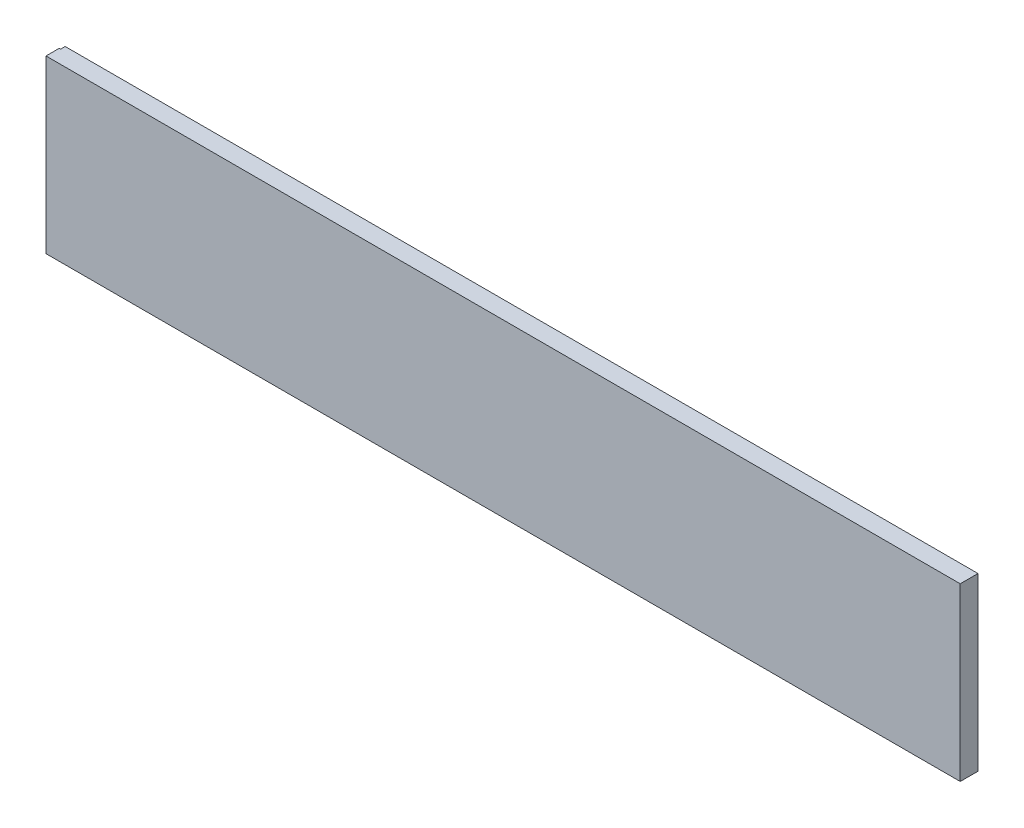
ISO-10303-21;
HEADER;
FILE_DESCRIPTION(('STEP AP214'),'2;1');
FILE_NAME('part.step','',(''),(''),'','','');
FILE_SCHEMA(('AUTOMOTIVE_DESIGN { 1 0 10303 214 1 1 1 1 }'));
ENDSEC;
DATA;
#1=APPLICATION_CONTEXT('core data for automotive mechanical design processes');
#2=APPLICATION_PROTOCOL_DEFINITION('international standard','automotive_design',2000,#1);
#3=PRODUCT_CONTEXT('',#1,'mechanical');
#4=PRODUCT('Part','Part','',(#3));
#5=PRODUCT_RELATED_PRODUCT_CATEGORY('part','',(#4));
#6=PRODUCT_DEFINITION_FORMATION('','',#4);
#7=PRODUCT_DEFINITION_CONTEXT('part definition',#1,'design');
#8=PRODUCT_DEFINITION('design','',#6,#7);
#9=PRODUCT_DEFINITION_SHAPE('','',#8);
#10=(LENGTH_UNIT() NAMED_UNIT(*) SI_UNIT(.MILLI.,.METRE.));
#11=(NAMED_UNIT(*) PLANE_ANGLE_UNIT() SI_UNIT($,.RADIAN.));
#12=(NAMED_UNIT(*) SI_UNIT($,.STERADIAN.) SOLID_ANGLE_UNIT());
#13=UNCERTAINTY_MEASURE_WITH_UNIT(LENGTH_MEASURE(1.E-05),#10,'distance_accuracy_value','');
#14=(GEOMETRIC_REPRESENTATION_CONTEXT(3) GLOBAL_UNCERTAINTY_ASSIGNED_CONTEXT((#13)) GLOBAL_UNIT_ASSIGNED_CONTEXT((#10,
#11,#12)) REPRESENTATION_CONTEXT('',''));
#15=CARTESIAN_POINT('',(0.,0.,0.));
#16=DIRECTION('',(0.,0.,1.));
#17=DIRECTION('',(1.,0.,0.));
#18=AXIS2_PLACEMENT_3D('',#15,#16,#17);
#19=CARTESIAN_POINT('',(0.,95.04,20.));
#20=DIRECTION('',(0.,0.,-1.));
#21=DIRECTION('',(-1.,0.,0.));
#22=AXIS2_PLACEMENT_3D('',#19,#20,#21);
#23=CYLINDRICAL_SURFACE('',#22,20.52);
#24=CARTESIAN_POINT('',(0.,95.04,20.));
#25=DIRECTION('',(0.,0.,1.));
#26=DIRECTION('',(1.,0.,0.));
#27=AXIS2_PLACEMENT_3D('',#24,#25,#26);
#28=CIRCLE('',#27,20.52);
#29=CARTESIAN_POINT('',(20.52,95.04,20.));
#30=VERTEX_POINT('',#29);
#31=EDGE_CURVE('E220',#30,#30,#28,.T.);
#32=ORIENTED_EDGE('',*,*,#31,.T.);
#33=EDGE_LOOP('',(#32));
#34=FACE_BOUND('',#33,.T.);
#35=CARTESIAN_POINT('',(0.,95.04,0.));
#36=DIRECTION('',(0.,0.,1.));
#37=DIRECTION('',(1.,0.,0.));
#38=AXIS2_PLACEMENT_3D('',#35,#36,#37);
#39=CIRCLE('',#38,20.52);
#40=CARTESIAN_POINT('',(20.52,95.04,0.));
#41=VERTEX_POINT('',#40);
#42=EDGE_CURVE('E224',#41,#41,#39,.T.);
#43=ORIENTED_EDGE('',*,*,#42,.F.);
#44=EDGE_LOOP('',(#43));
#45=FACE_BOUND('',#44,.T.);
#46=ADVANCED_FACE('F41',(#34,#45),#23,.F.);
#47=CARTESIAN_POINT('',(0.,-95.04,20.));
#48=DIRECTION('',(0.,0.,-1.));
#49=DIRECTION('',(-1.,0.,0.));
#50=AXIS2_PLACEMENT_3D('',#47,#48,#49);
#51=CYLINDRICAL_SURFACE('',#50,20.52);
#52=CARTESIAN_POINT('',(0.,-95.04,20.));
#53=DIRECTION('',(0.,0.,1.));
#54=DIRECTION('',(1.,0.,0.));
#55=AXIS2_PLACEMENT_3D('',#52,#53,#54);
#56=CIRCLE('',#55,20.52);
#57=CARTESIAN_POINT('',(20.52,-95.04,20.));
#58=VERTEX_POINT('',#57);
#59=EDGE_CURVE('E225',#58,#58,#56,.F.);
#60=ORIENTED_EDGE('',*,*,#59,.F.);
#61=EDGE_LOOP('',(#60));
#62=FACE_BOUND('',#61,.T.);
#63=CARTESIAN_POINT('',(0.,-95.04,0.));
#64=DIRECTION('',(0.,0.,1.));
#65=DIRECTION('',(1.,0.,0.));
#66=AXIS2_PLACEMENT_3D('',#63,#64,#65);
#67=CIRCLE('',#66,20.52);
#68=CARTESIAN_POINT('',(20.52,-95.04,0.));
#69=VERTEX_POINT('',#68);
#70=EDGE_CURVE('E229',#69,#69,#67,.F.);
#71=ORIENTED_EDGE('',*,*,#70,.T.);
#72=EDGE_LOOP('',(#71));
#73=FACE_BOUND('',#72,.T.);
#74=ADVANCED_FACE('F284',(#62,#73),#51,.F.);
#75=CARTESIAN_POINT('',(0.,0.,0.));
#76=DIRECTION('',(0.,0.,1.));
#77=DIRECTION('',(1.,0.,0.));
#78=AXIS2_PLACEMENT_3D('',#75,#76,#77);
#79=PLANE('',#78);
#80=DIRECTION('',(0.,1.,0.));
#81=VECTOR('',#80,1.);
#82=CARTESIAN_POINT('',(-382.534820873417,0.,0.));
#83=LINE('',#82,#81);
#84=CARTESIAN_POINT('',(-382.534820873417,-132.64,0.));
#85=VERTEX_POINT('',#84);
#86=CARTESIAN_POINT('',(-382.534820873417,212.640000000001,0.));
#87=VERTEX_POINT('',#86);
#88=EDGE_CURVE('E172',#85,#87,#83,.T.);
#89=ORIENTED_EDGE('',*,*,#88,.T.);
#90=DIRECTION('',(1.,0.,0.));
#91=VECTOR('',#90,1.);
#92=CARTESIAN_POINT('',(0.,212.640000000001,0.));
#93=LINE('',#92,#91);
#94=CARTESIAN_POINT('',(1630.50809260547,212.640000000001,0.));
#95=VERTEX_POINT('',#94);
#96=EDGE_CURVE('E124',#87,#95,#93,.T.);
#97=ORIENTED_EDGE('',*,*,#96,.T.);
#98=DIRECTION('',(0.,-1.,0.));
#99=VECTOR('',#98,1.);
#100=CARTESIAN_POINT('',(1630.50809260547,-1.01586584749159E-12,0.));
#101=LINE('',#100,#99);
#102=CARTESIAN_POINT('',(1630.50809260547,-132.64,0.));
#103=VERTEX_POINT('',#102);
#104=EDGE_CURVE('E177',#95,#103,#101,.T.);
#105=ORIENTED_EDGE('',*,*,#104,.T.);
#106=DIRECTION('',(-1.,0.,0.));
#107=VECTOR('',#106,1.);
#108=CARTESIAN_POINT('',(0.,-132.64,0.));
#109=LINE('',#108,#107);
#110=EDGE_CURVE('E56',#103,#85,#109,.T.);
#111=ORIENTED_EDGE('',*,*,#110,.T.);
#112=EDGE_LOOP('',(#89,#97,#105,#111));
#113=FACE_BOUND('',#112,.T.);
#114=ORIENTED_EDGE('',*,*,#42,.T.);
#115=EDGE_LOOP('',(#114));
#116=FACE_BOUND('',#115,.T.);
#117=CARTESIAN_POINT('',(0.,0.,0.));
#118=DIRECTION('',(0.,0.,1.));
#119=DIRECTION('',(1.,0.,0.));
#120=AXIS2_PLACEMENT_3D('',#117,#118,#119);
#121=CIRCLE('',#120,36.);
#122=CARTESIAN_POINT('',(36.,0.,0.));
#123=VERTEX_POINT('',#122);
#124=EDGE_CURVE('E200',#123,#123,#121,.F.);
#125=ORIENTED_EDGE('',*,*,#124,.F.);
#126=EDGE_LOOP('',(#125));
#127=FACE_BOUND('',#126,.T.);
#128=ORIENTED_EDGE('',*,*,#70,.F.);
#129=EDGE_LOOP('',(#128));
#130=FACE_BOUND('',#129,.T.);
#131=ADVANCED_FACE('F289',(#113,#116,#127,#130),#79,.F.);
#132=CARTESIAN_POINT('',(0.,0.,20.));
#133=DIRECTION('',(0.,0.,1.));
#134=DIRECTION('',(1.,0.,0.));
#135=AXIS2_PLACEMENT_3D('',#132,#133,#134);
#136=PLANE('',#135);
#137=ORIENTED_EDGE('',*,*,#59,.T.);
#138=EDGE_LOOP('',(#137));
#139=FACE_BOUND('',#138,.T.);
#140=ADVANCED_FACE('F298',(#139),#136,.F.);
#141=ORIENTED_EDGE('',*,*,#31,.F.);
#142=EDGE_LOOP('',(#141));
#143=FACE_BOUND('',#142,.T.);
#144=ADVANCED_FACE('F309',(#143),#136,.F.);
#145=CARTESIAN_POINT('',(0.,0.,-10.));
#146=DIRECTION('',(0.,0.,1.));
#147=DIRECTION('',(1.,0.,0.));
#148=AXIS2_PLACEMENT_3D('',#145,#146,#147);
#149=CYLINDRICAL_SURFACE('',#148,36.);
#150=CARTESIAN_POINT('',(0.,0.,-10.));
#151=DIRECTION('',(0.,0.,-1.));
#152=DIRECTION('',(-1.,0.,0.));
#153=AXIS2_PLACEMENT_3D('',#150,#151,#152);
#154=CIRCLE('',#153,36.);
#155=CARTESIAN_POINT('',(-36.,0.,-10.));
#156=VERTEX_POINT('',#155);
#157=EDGE_CURVE('E189',#156,#156,#154,.T.);
#158=ORIENTED_EDGE('',*,*,#157,.F.);
#159=EDGE_LOOP('',(#158));
#160=FACE_BOUND('',#159,.T.);
#161=ORIENTED_EDGE('',*,*,#124,.T.);
#162=EDGE_LOOP('',(#161));
#163=FACE_BOUND('',#162,.T.);
#164=ADVANCED_FACE('F306',(#160,#163),#149,.T.);
#165=CARTESIAN_POINT('',(0.,0.,-10.));
#166=DIRECTION('',(0.,0.,-1.));
#167=DIRECTION('',(-1.,0.,0.));
#168=AXIS2_PLACEMENT_3D('',#165,#166,#167);
#169=PLANE('',#168);
#170=ORIENTED_EDGE('',*,*,#157,.T.);
#171=EDGE_LOOP('',(#170));
#172=FACE_BOUND('',#171,.T.);
#173=ADVANCED_FACE('F308',(#172),#169,.T.);
#174=CARTESIAN_POINT('',(-403.23369681181,0.,-10.));
#175=DIRECTION('',(-1.,0.,0.));
#176=DIRECTION('',(0.,0.,1.));
#177=AXIS2_PLACEMENT_3D('',#174,#175,#176);
#178=PLANE('',#177);
#179=DIRECTION('',(0.,-1.,0.));
#180=VECTOR('',#179,1.);
#181=CARTESIAN_POINT('',(-403.23369681181,0.,0.));
#182=LINE('',#181,#180);
#183=CARTESIAN_POINT('',(-403.23369681181,232.64,0.));
#184=VERTEX_POINT('',#183);
#185=CARTESIAN_POINT('',(-403.23369681181,-152.64,0.));
#186=VERTEX_POINT('',#185);
#187=EDGE_CURVE('E143',#184,#186,#182,.T.);
#188=ORIENTED_EDGE('',*,*,#187,.F.);
#189=DIRECTION('',(0.,0.,1.));
#190=VECTOR('',#189,1.);
#191=CARTESIAN_POINT('',(-403.23369681181,232.64,-10.));
#192=LINE('',#191,#190);
#193=CARTESIAN_POINT('',(-403.23369681181,232.64,-10.));
#194=VERTEX_POINT('',#193);
#195=EDGE_CURVE('E186',#194,#184,#192,.T.);
#196=ORIENTED_EDGE('',*,*,#195,.F.);
#197=DIRECTION('',(0.,-1.,0.));
#198=VECTOR('',#197,1.);
#199=CARTESIAN_POINT('',(-403.23369681181,0.,-10.));
#200=LINE('',#199,#198);
#201=CARTESIAN_POINT('',(-403.23369681181,-152.64,-10.));
#202=VERTEX_POINT('',#201);
#203=EDGE_CURVE('E154',#194,#202,#200,.T.);
#204=ORIENTED_EDGE('',*,*,#203,.T.);
#205=DIRECTION('',(0.,0.,1.));
#206=VECTOR('',#205,1.);
#207=CARTESIAN_POINT('',(-403.23369681181,-152.64,-10.));
#208=LINE('',#207,#206);
#209=EDGE_CURVE('E130',#202,#186,#208,.T.);
#210=ORIENTED_EDGE('',*,*,#209,.T.);
#211=EDGE_LOOP('',(#188,#196,#204,#210));
#212=FACE_BOUND('',#211,.T.);
#213=ADVANCED_FACE('F266',(#212),#178,.T.);
#214=CARTESIAN_POINT('',(0.,212.640000000001,-10.));
#215=DIRECTION('',(0.,-1.,0.));
#216=DIRECTION('',(0.,0.,-1.));
#217=AXIS2_PLACEMENT_3D('',#214,#215,#216);
#218=PLANE('',#217);
#219=ORIENTED_EDGE('',*,*,#96,.F.);
#220=DIRECTION('',(0.,0.,1.));
#221=VECTOR('',#220,1.);
#222=CARTESIAN_POINT('',(-382.534820873417,212.640000000001,-10.));
#223=LINE('',#222,#221);
#224=CARTESIAN_POINT('',(-382.534820873417,212.640000000001,-10.));
#225=VERTEX_POINT('',#224);
#226=EDGE_CURVE('E118',#225,#87,#223,.T.);
#227=ORIENTED_EDGE('',*,*,#226,.F.);
#228=DIRECTION('',(1.,0.,0.));
#229=VECTOR('',#228,1.);
#230=CARTESIAN_POINT('',(0.,212.640000000001,-10.));
#231=LINE('',#230,#229);
#232=CARTESIAN_POINT('',(1630.50809260547,212.640000000001,-10.));
#233=VERTEX_POINT('',#232);
#234=EDGE_CURVE('E121',#225,#233,#231,.T.);
#235=ORIENTED_EDGE('',*,*,#234,.T.);
#236=DIRECTION('',(0.,0.,1.));
#237=VECTOR('',#236,1.);
#238=CARTESIAN_POINT('',(1630.50809260547,212.640000000001,-10.));
#239=LINE('',#238,#237);
#240=EDGE_CURVE('E169',#233,#95,#239,.T.);
#241=ORIENTED_EDGE('',*,*,#240,.T.);
#242=EDGE_LOOP('',(#219,#227,#235,#241));
#243=FACE_BOUND('',#242,.T.);
#244=ADVANCED_FACE('F120',(#243),#218,.T.);
#245=CARTESIAN_POINT('',(-382.534820873417,0.,-10.));
#246=DIRECTION('',(1.,0.,0.));
#247=DIRECTION('',(0.,0.,-1.));
#248=AXIS2_PLACEMENT_3D('',#245,#246,#247);
#249=PLANE('',#248);
#250=ORIENTED_EDGE('',*,*,#88,.F.);
#251=DIRECTION('',(0.,0.,1.));
#252=VECTOR('',#251,1.);
#253=CARTESIAN_POINT('',(-382.534820873417,-132.64,-10.));
#254=LINE('',#253,#252);
#255=CARTESIAN_POINT('',(-382.534820873417,-132.64,-10.));
#256=VERTEX_POINT('',#255);
#257=EDGE_CURVE('E131',#256,#85,#254,.T.);
#258=ORIENTED_EDGE('',*,*,#257,.F.);
#259=DIRECTION('',(0.,1.,0.));
#260=VECTOR('',#259,1.);
#261=CARTESIAN_POINT('',(-382.534820873417,0.,-10.));
#262=LINE('',#261,#260);
#263=EDGE_CURVE('E138',#256,#225,#262,.T.);
#264=ORIENTED_EDGE('',*,*,#263,.T.);
#265=ORIENTED_EDGE('',*,*,#226,.T.);
#266=EDGE_LOOP('',(#250,#258,#264,#265));
#267=FACE_BOUND('',#266,.T.);
#268=ADVANCED_FACE('F145',(#267),#249,.T.);
#269=CARTESIAN_POINT('',(0.,-132.64,-10.));
#270=DIRECTION('',(0.,1.,0.));
#271=DIRECTION('',(-1.,0.,0.));
#272=AXIS2_PLACEMENT_3D('',#269,#270,#271);
#273=PLANE('',#272);
#274=ORIENTED_EDGE('',*,*,#110,.F.);
#275=DIRECTION('',(0.,0.,1.));
#276=VECTOR('',#275,1.);
#277=CARTESIAN_POINT('',(1630.50809260547,-132.64,-10.));
#278=LINE('',#277,#276);
#279=CARTESIAN_POINT('',(1630.50809260547,-132.64,-10.));
#280=VERTEX_POINT('',#279);
#281=EDGE_CURVE('E192',#280,#103,#278,.T.);
#282=ORIENTED_EDGE('',*,*,#281,.F.);
#283=DIRECTION('',(-1.,0.,0.));
#284=VECTOR('',#283,1.);
#285=CARTESIAN_POINT('',(0.,-132.64,-10.));
#286=LINE('',#285,#284);
#287=EDGE_CURVE('E147',#280,#256,#286,.T.);
#288=ORIENTED_EDGE('',*,*,#287,.T.);
#289=ORIENTED_EDGE('',*,*,#257,.T.);
#290=EDGE_LOOP('',(#274,#282,#288,#289));
#291=FACE_BOUND('',#290,.T.);
#292=ADVANCED_FACE('F369',(#291),#273,.T.);
#293=CARTESIAN_POINT('',(1630.50809260547,-1.01586584749159E-12,-10.));
#294=DIRECTION('',(-1.,0.,0.));
#295=DIRECTION('',(0.,-1.,0.));
#296=AXIS2_PLACEMENT_3D('',#293,#294,#295);
#297=PLANE('',#296);
#298=ORIENTED_EDGE('',*,*,#104,.F.);
#299=ORIENTED_EDGE('',*,*,#240,.F.);
#300=DIRECTION('',(0.,-1.,0.));
#301=VECTOR('',#300,1.);
#302=CARTESIAN_POINT('',(1630.50809260547,-1.01586584749159E-12,-10.));
#303=LINE('',#302,#301);
#304=EDGE_CURVE('E141',#233,#280,#303,.T.);
#305=ORIENTED_EDGE('',*,*,#304,.T.);
#306=ORIENTED_EDGE('',*,*,#281,.T.);
#307=EDGE_LOOP('',(#298,#299,#305,#306));
#308=FACE_BOUND('',#307,.T.);
#309=ADVANCED_FACE('F360',(#308),#297,.T.);
#310=CARTESIAN_POINT('',(0.,0.,-10.));
#311=DIRECTION('',(0.,0.,-1.));
#312=DIRECTION('',(-1.,0.,0.));
#313=AXIS2_PLACEMENT_3D('',#310,#311,#312);
#314=PLANE('',#313);
#315=ORIENTED_EDGE('',*,*,#234,.F.);
#316=ORIENTED_EDGE('',*,*,#263,.F.);
#317=ORIENTED_EDGE('',*,*,#287,.F.);
#318=ORIENTED_EDGE('',*,*,#304,.F.);
#319=EDGE_LOOP('',(#315,#316,#317,#318));
#320=FACE_BOUND('',#319,.T.);
#321=ORIENTED_EDGE('',*,*,#203,.F.);
#322=DIRECTION('',(1.,0.,0.));
#323=VECTOR('',#322,1.);
#324=CARTESIAN_POINT('',(0.,232.64,-10.));
#325=LINE('',#324,#323);
#326=CARTESIAN_POINT('',(1650.50809260547,232.64,-10.));
#327=VERTEX_POINT('',#326);
#328=EDGE_CURVE('E158',#194,#327,#325,.T.);
#329=ORIENTED_EDGE('',*,*,#328,.T.);
#330=DIRECTION('',(0.,-1.,0.));
#331=VECTOR('',#330,1.);
#332=CARTESIAN_POINT('',(1650.50809260547,0.,-10.));
#333=LINE('',#332,#331);
#334=CARTESIAN_POINT('',(1650.50809260547,-152.64,-10.));
#335=VERTEX_POINT('',#334);
#336=EDGE_CURVE('E162',#327,#335,#333,.T.);
#337=ORIENTED_EDGE('',*,*,#336,.T.);
#338=DIRECTION('',(-1.,0.,0.));
#339=VECTOR('',#338,1.);
#340=CARTESIAN_POINT('',(0.,-152.64,-10.));
#341=LINE('',#340,#339);
#342=EDGE_CURVE('E166',#335,#202,#341,.T.);
#343=ORIENTED_EDGE('',*,*,#342,.T.);
#344=EDGE_LOOP('',(#321,#329,#337,#343));
#345=FACE_BOUND('',#344,.T.);
#346=ADVANCED_FACE('F135',(#320,#345),#314,.T.);
#347=CARTESIAN_POINT('',(-406.4,0.,20.));
#348=DIRECTION('',(-1.,0.,0.));
#349=DIRECTION('',(0.,0.,1.));
#350=AXIS2_PLACEMENT_3D('',#347,#348,#349);
#351=PLANE('',#350);
#352=DIRECTION('',(0.,1.,0.));
#353=VECTOR('',#352,1.);
#354=CARTESIAN_POINT('',(-406.4,0.,0.));
#355=LINE('',#354,#353);
#356=CARTESIAN_POINT('',(-406.4,-152.64,0.));
#357=VERTEX_POINT('',#356);
#358=CARTESIAN_POINT('',(-406.4,232.64,0.));
#359=VERTEX_POINT('',#358);
#360=EDGE_CURVE('E240',#357,#359,#355,.T.);
#361=ORIENTED_EDGE('',*,*,#360,.F.);
#362=DIRECTION('',(0.,0.,-1.));
#363=VECTOR('',#362,1.);
#364=CARTESIAN_POINT('',(-406.4,-152.64,20.));
#365=LINE('',#364,#363);
#366=CARTESIAN_POINT('',(-406.4,-152.64,30.));
#367=VERTEX_POINT('',#366);
#368=EDGE_CURVE('E64',#367,#357,#365,.T.);
#369=ORIENTED_EDGE('',*,*,#368,.F.);
#370=DIRECTION('',(0.,-1.,0.));
#371=VECTOR('',#370,1.);
#372=CARTESIAN_POINT('',(-406.4,232.64,30.));
#373=LINE('',#372,#371);
#374=CARTESIAN_POINT('',(-406.4,232.64,30.));
#375=VERTEX_POINT('',#374);
#376=EDGE_CURVE('E208',#375,#367,#373,.T.);
#377=ORIENTED_EDGE('',*,*,#376,.F.);
#378=DIRECTION('',(0.,0.,-1.));
#379=VECTOR('',#378,1.);
#380=CARTESIAN_POINT('',(-406.4,232.64,20.));
#381=LINE('',#380,#379);
#382=EDGE_CURVE('E249',#375,#359,#381,.T.);
#383=ORIENTED_EDGE('',*,*,#382,.T.);
#384=EDGE_LOOP('',(#361,#369,#377,#383));
#385=FACE_BOUND('',#384,.T.);
#386=ADVANCED_FACE('F272',(#385),#351,.T.);
#387=CARTESIAN_POINT('',(0.,0.,30.));
#388=DIRECTION('',(0.,0.,1.));
#389=DIRECTION('',(1.,0.,0.));
#390=AXIS2_PLACEMENT_3D('',#387,#388,#389);
#391=PLANE('',#390);
#392=DIRECTION('',(-1.,0.,0.));
#393=VECTOR('',#392,1.);
#394=CARTESIAN_POINT('',(1650.50809260547,232.64,30.));
#395=LINE('',#394,#393);
#396=CARTESIAN_POINT('',(1650.50809260547,232.64,30.));
#397=VERTEX_POINT('',#396);
#398=EDGE_CURVE('E204',#397,#375,#395,.T.);
#399=ORIENTED_EDGE('',*,*,#398,.T.);
#400=ORIENTED_EDGE('',*,*,#376,.T.);
#401=DIRECTION('',(1.,0.,0.));
#402=VECTOR('',#401,1.);
#403=CARTESIAN_POINT('',(-406.4,-152.64,30.));
#404=LINE('',#403,#402);
#405=CARTESIAN_POINT('',(1650.50809260547,-152.64,30.));
#406=VERTEX_POINT('',#405);
#407=EDGE_CURVE('E212',#367,#406,#404,.T.);
#408=ORIENTED_EDGE('',*,*,#407,.T.);
#409=DIRECTION('',(0.,1.,0.));
#410=VECTOR('',#409,1.);
#411=CARTESIAN_POINT('',(1650.50809260547,-152.64,30.));
#412=LINE('',#411,#410);
#413=EDGE_CURVE('E216',#406,#397,#412,.T.);
#414=ORIENTED_EDGE('',*,*,#413,.T.);
#415=EDGE_LOOP('',(#399,#400,#408,#414));
#416=FACE_BOUND('',#415,.T.);
#417=ADVANCED_FACE('F274',(#416),#391,.T.);
#418=CARTESIAN_POINT('',(0.,-152.64,20.));
#419=DIRECTION('',(0.,1.,0.));
#420=DIRECTION('',(0.,0.,1.));
#421=AXIS2_PLACEMENT_3D('',#418,#419,#420);
#422=PLANE('',#421);
#423=DIRECTION('',(1.,0.,0.));
#424=VECTOR('',#423,1.);
#425=CARTESIAN_POINT('',(0.,-152.64,0.));
#426=LINE('',#425,#424);
#427=EDGE_CURVE('E233',#357,#186,#426,.T.);
#428=ORIENTED_EDGE('',*,*,#427,.T.);
#429=ORIENTED_EDGE('',*,*,#209,.F.);
#430=ORIENTED_EDGE('',*,*,#342,.F.);
#431=DIRECTION('',(0.,0.,-1.));
#432=VECTOR('',#431,1.);
#433=CARTESIAN_POINT('',(1650.50809260547,-152.64,20.));
#434=LINE('',#433,#432);
#435=EDGE_CURVE('E11',#406,#335,#434,.T.);
#436=ORIENTED_EDGE('',*,*,#435,.F.);
#437=ORIENTED_EDGE('',*,*,#407,.F.);
#438=ORIENTED_EDGE('',*,*,#368,.T.);
#439=EDGE_LOOP('',(#428,#429,#430,#436,#437,#438));
#440=FACE_BOUND('',#439,.T.);
#441=ADVANCED_FACE('F275',(#440),#422,.F.);
#442=CARTESIAN_POINT('',(1650.50809260547,0.,20.));
#443=DIRECTION('',(-1.,0.,0.));
#444=DIRECTION('',(0.,0.,1.));
#445=AXIS2_PLACEMENT_3D('',#442,#443,#444);
#446=PLANE('',#445);
#447=ORIENTED_EDGE('',*,*,#435,.T.);
#448=ORIENTED_EDGE('',*,*,#336,.F.);
#449=DIRECTION('',(0.,0.,-1.));
#450=VECTOR('',#449,1.);
#451=CARTESIAN_POINT('',(1650.50809260547,232.64,20.));
#452=LINE('',#451,#450);
#453=EDGE_CURVE('E49',#397,#327,#452,.T.);
#454=ORIENTED_EDGE('',*,*,#453,.F.);
#455=ORIENTED_EDGE('',*,*,#413,.F.);
#456=EDGE_LOOP('',(#447,#448,#454,#455));
#457=FACE_BOUND('',#456,.T.);
#458=ADVANCED_FACE('F261',(#457),#446,.F.);
#459=CARTESIAN_POINT('',(0.,232.64,20.));
#460=DIRECTION('',(0.,1.,0.));
#461=DIRECTION('',(0.,0.,1.));
#462=AXIS2_PLACEMENT_3D('',#459,#460,#461);
#463=PLANE('',#462);
#464=DIRECTION('',(1.,0.,0.));
#465=VECTOR('',#464,1.);
#466=CARTESIAN_POINT('',(0.,232.64,0.));
#467=LINE('',#466,#465);
#468=EDGE_CURVE('E236',#359,#184,#467,.T.);
#469=ORIENTED_EDGE('',*,*,#468,.F.);
#470=ORIENTED_EDGE('',*,*,#382,.F.);
#471=ORIENTED_EDGE('',*,*,#398,.F.);
#472=ORIENTED_EDGE('',*,*,#453,.T.);
#473=ORIENTED_EDGE('',*,*,#328,.F.);
#474=ORIENTED_EDGE('',*,*,#195,.T.);
#475=EDGE_LOOP('',(#469,#470,#471,#472,#473,#474));
#476=FACE_BOUND('',#475,.T.);
#477=ADVANCED_FACE('F257',(#476),#463,.T.);
#478=ORIENTED_EDGE('',*,*,#468,.T.);
#479=ORIENTED_EDGE('',*,*,#187,.T.);
#480=ORIENTED_EDGE('',*,*,#427,.F.);
#481=ORIENTED_EDGE('',*,*,#360,.T.);
#482=EDGE_LOOP('',(#478,#479,#480,#481));
#483=FACE_BOUND('',#482,.T.);
#484=ADVANCED_FACE('F270',(#483),#79,.F.);
#485=CLOSED_SHELL('',(#46,#74,#131,#140,#144,#164,#173,#213,#244,#268,#292,#309,#346,#386,#417,
#441,#458,#477,#484));
#486=MANIFOLD_SOLID_BREP('B2',#485);
#487=ADVANCED_BREP_SHAPE_REPRESENTATION('',(#18,#486),#14);
#488=SHAPE_DEFINITION_REPRESENTATION(#9,#487);
ENDSEC;
END-ISO-10303-21;
